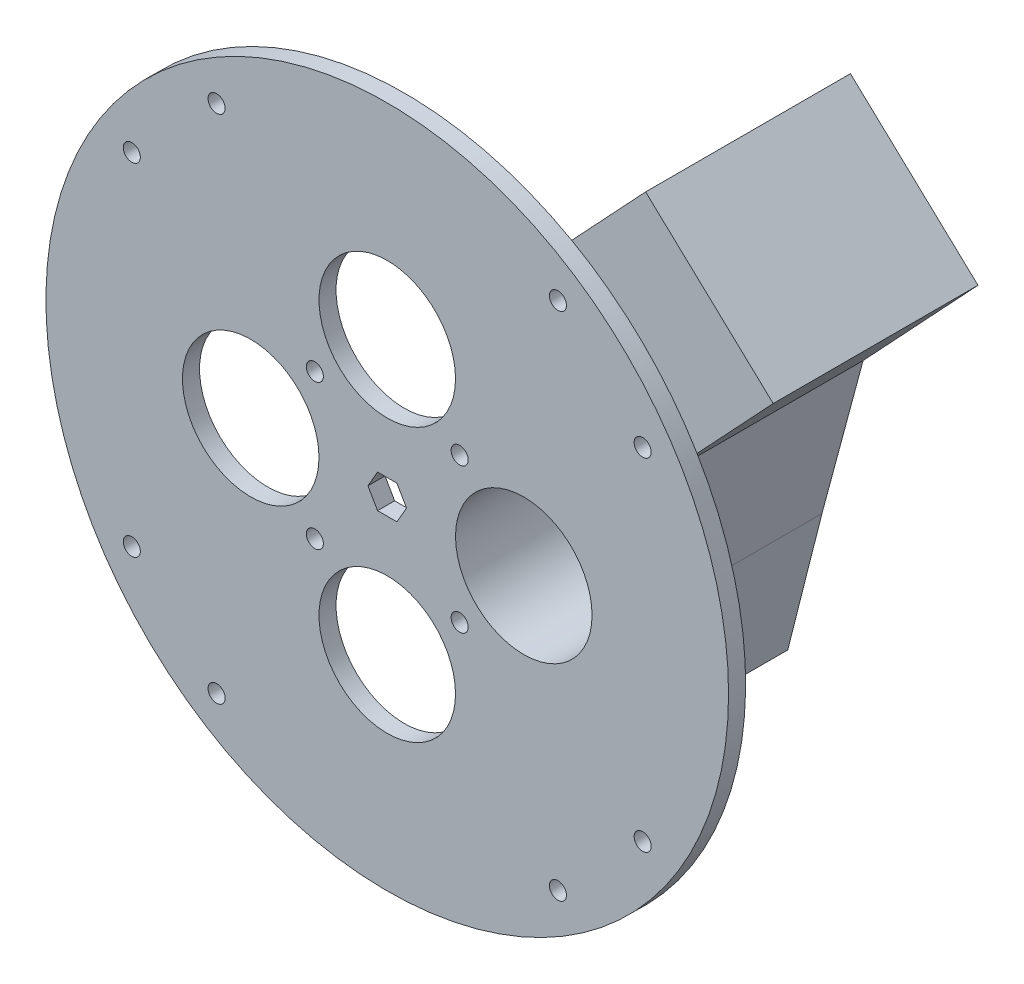
ISO-10303-21;
HEADER;
FILE_DESCRIPTION(('STEP AP214'),'2;1');
FILE_NAME('part.step','',(''),(''),'','','');
FILE_SCHEMA(('AUTOMOTIVE_DESIGN { 1 0 10303 214 1 1 1 1 }'));
ENDSEC;
DATA;
#1=APPLICATION_CONTEXT('core data for automotive mechanical design processes');
#2=APPLICATION_PROTOCOL_DEFINITION('international standard','automotive_design',2000,#1);
#3=PRODUCT_CONTEXT('',#1,'mechanical');
#4=PRODUCT('Part','Part','',(#3));
#5=PRODUCT_RELATED_PRODUCT_CATEGORY('part','',(#4));
#6=PRODUCT_DEFINITION_FORMATION('','',#4);
#7=PRODUCT_DEFINITION_CONTEXT('part definition',#1,'design');
#8=PRODUCT_DEFINITION('design','',#6,#7);
#9=PRODUCT_DEFINITION_SHAPE('','',#8);
#10=(LENGTH_UNIT() NAMED_UNIT(*) SI_UNIT(.MILLI.,.METRE.));
#11=(NAMED_UNIT(*) PLANE_ANGLE_UNIT() SI_UNIT($,.RADIAN.));
#12=(NAMED_UNIT(*) SI_UNIT($,.STERADIAN.) SOLID_ANGLE_UNIT());
#13=UNCERTAINTY_MEASURE_WITH_UNIT(LENGTH_MEASURE(1.E-05),#10,'distance_accuracy_value','');
#14=(GEOMETRIC_REPRESENTATION_CONTEXT(3) GLOBAL_UNCERTAINTY_ASSIGNED_CONTEXT((#13)) GLOBAL_UNIT_ASSIGNED_CONTEXT((#10,
#11,#12)) REPRESENTATION_CONTEXT('',''));
#15=CARTESIAN_POINT('',(0.,0.,0.));
#16=DIRECTION('',(0.,0.,1.));
#17=DIRECTION('',(1.,0.,0.));
#18=AXIS2_PLACEMENT_3D('',#15,#16,#17);
#19=CARTESIAN_POINT('',(0.,0.,0.));
#20=DIRECTION('',(0.,0.,1.));
#21=DIRECTION('',(1.,0.,0.));
#22=AXIS2_PLACEMENT_3D('',#19,#20,#21);
#23=PLANE('',#22);
#24=CARTESIAN_POINT('',(-50.8,0.,0.));
#25=DIRECTION('',(0.,0.,1.));
#26=DIRECTION('',(1.,0.,0.));
#27=AXIS2_PLACEMENT_3D('',#24,#25,#26);
#28=CIRCLE('',#27,25.4);
#29=CARTESIAN_POINT('',(-25.4,0.,0.));
#30=VERTEX_POINT('',#29);
#31=EDGE_CURVE('E274',#30,#30,#28,.T.);
#32=ORIENTED_EDGE('',*,*,#31,.T.);
#33=EDGE_LOOP('',(#32));
#34=FACE_BOUND('',#33,.T.);
#35=CARTESIAN_POINT('',(0.,-50.8,0.));
#36=DIRECTION('',(0.,0.,1.));
#37=DIRECTION('',(1.,0.,0.));
#38=AXIS2_PLACEMENT_3D('',#35,#36,#37);
#39=CIRCLE('',#38,25.4);
#40=CARTESIAN_POINT('',(25.4,-50.8,0.));
#41=VERTEX_POINT('',#40);
#42=EDGE_CURVE('E278',#41,#41,#39,.T.);
#43=ORIENTED_EDGE('',*,*,#42,.T.);
#44=EDGE_LOOP('',(#43));
#45=FACE_BOUND('',#44,.T.);
#46=DIRECTION('',(0.5,0.866025403784439,0.));
#47=VECTOR('',#46,1.);
#48=CARTESIAN_POINT('',(3.59285072516704,-6.223,0.));
#49=LINE('',#48,#47);
#50=CARTESIAN_POINT('',(3.59285072516704,-6.223,0.));
#51=VERTEX_POINT('',#50);
#52=CARTESIAN_POINT('',(7.18570145033408,0.,0.));
#53=VERTEX_POINT('',#52);
#54=EDGE_CURVE('E289',#51,#53,#49,.T.);
#55=ORIENTED_EDGE('',*,*,#54,.T.);
#56=DIRECTION('',(-0.5,0.866025403784438,0.));
#57=VECTOR('',#56,1.);
#58=CARTESIAN_POINT('',(7.18570145033408,0.,0.));
#59=LINE('',#58,#57);
#60=CARTESIAN_POINT('',(3.59285072516704,6.223,0.));
#61=VERTEX_POINT('',#60);
#62=EDGE_CURVE('E307',#53,#61,#59,.T.);
#63=ORIENTED_EDGE('',*,*,#62,.T.);
#64=DIRECTION('',(-1.,0.,0.));
#65=VECTOR('',#64,1.);
#66=CARTESIAN_POINT('',(3.59285072516704,6.223,0.));
#67=LINE('',#66,#65);
#68=CARTESIAN_POINT('',(-3.59285072516704,6.223,0.));
#69=VERTEX_POINT('',#68);
#70=EDGE_CURVE('E310',#61,#69,#67,.T.);
#71=ORIENTED_EDGE('',*,*,#70,.T.);
#72=DIRECTION('',(-0.5,-0.866025403784439,0.));
#73=VECTOR('',#72,1.);
#74=CARTESIAN_POINT('',(-3.59285072516704,6.223,0.));
#75=LINE('',#74,#73);
#76=CARTESIAN_POINT('',(-7.18570145033408,0.,0.));
#77=VERTEX_POINT('',#76);
#78=EDGE_CURVE('E313',#69,#77,#75,.T.);
#79=ORIENTED_EDGE('',*,*,#78,.T.);
#80=DIRECTION('',(0.5,-0.866025403784439,0.));
#81=VECTOR('',#80,1.);
#82=CARTESIAN_POINT('',(-7.18570145033408,0.,0.));
#83=LINE('',#82,#81);
#84=CARTESIAN_POINT('',(-3.59285072516704,-6.223,0.));
#85=VERTEX_POINT('',#84);
#86=EDGE_CURVE('E316',#77,#85,#83,.T.);
#87=ORIENTED_EDGE('',*,*,#86,.T.);
#88=DIRECTION('',(1.,0.,0.));
#89=VECTOR('',#88,1.);
#90=CARTESIAN_POINT('',(-3.59285072516704,-6.223,0.));
#91=LINE('',#90,#89);
#92=EDGE_CURVE('E293',#85,#51,#91,.T.);
#93=ORIENTED_EDGE('',*,*,#92,.T.);
#94=EDGE_LOOP('',(#55,#63,#71,#79,#87,#93));
#95=FACE_BOUND('',#94,.T.);
#96=CARTESIAN_POINT('',(0.,50.8,0.));
#97=DIRECTION('',(0.,0.,1.));
#98=DIRECTION('',(1.,0.,0.));
#99=AXIS2_PLACEMENT_3D('',#96,#97,#98);
#100=CIRCLE('',#99,25.4);
#101=CARTESIAN_POINT('',(25.4,50.8,0.));
#102=VERTEX_POINT('',#101);
#103=EDGE_CURVE('E334',#102,#102,#100,.T.);
#104=ORIENTED_EDGE('',*,*,#103,.T.);
#105=EDGE_LOOP('',(#104));
#106=FACE_BOUND('',#105,.T.);
#107=CARTESIAN_POINT('',(-63.5,-95.0380976240581,0.));
#108=DIRECTION('',(0.,0.,-1.));
#109=DIRECTION('',(-1.,0.,0.));
#110=AXIS2_PLACEMENT_3D('',#107,#108,#109);
#111=CIRCLE('',#110,3.175);
#112=CARTESIAN_POINT('',(-66.675,-95.0380976240581,0.));
#113=VERTEX_POINT('',#112);
#114=EDGE_CURVE('E222',#113,#113,#111,.T.);
#115=ORIENTED_EDGE('',*,*,#114,.F.);
#116=EDGE_LOOP('',(#115));
#117=FACE_BOUND('',#116,.T.);
#118=CARTESIAN_POINT('',(95.0380976240581,-63.5,0.));
#119=DIRECTION('',(0.,0.,-1.));
#120=DIRECTION('',(-1.,0.,0.));
#121=AXIS2_PLACEMENT_3D('',#118,#119,#120);
#122=CIRCLE('',#121,3.175);
#123=CARTESIAN_POINT('',(91.8630976240581,-63.5,0.));
#124=VERTEX_POINT('',#123);
#125=EDGE_CURVE('E206',#124,#124,#122,.T.);
#126=ORIENTED_EDGE('',*,*,#125,.F.);
#127=EDGE_LOOP('',(#126));
#128=FACE_BOUND('',#127,.T.);
#129=CARTESIAN_POINT('',(-63.5,95.0380976240581,0.));
#130=DIRECTION('',(0.,0.,-1.));
#131=DIRECTION('',(-1.,0.,0.));
#132=AXIS2_PLACEMENT_3D('',#129,#130,#131);
#133=CIRCLE('',#132,3.175);
#134=CARTESIAN_POINT('',(-66.675,95.0380976240581,0.));
#135=VERTEX_POINT('',#134);
#136=EDGE_CURVE('E242',#135,#135,#133,.T.);
#137=ORIENTED_EDGE('',*,*,#136,.F.);
#138=EDGE_LOOP('',(#137));
#139=FACE_BOUND('',#138,.T.);
#140=CARTESIAN_POINT('',(26.9407683632075,-26.9407683632075,0.));
#141=DIRECTION('',(0.,0.,-1.));
#142=DIRECTION('',(-1.,0.,0.));
#143=AXIS2_PLACEMENT_3D('',#140,#141,#142);
#144=CIRCLE('',#143,3.175);
#145=CARTESIAN_POINT('',(23.7657683632075,-26.9407683632075,0.));
#146=VERTEX_POINT('',#145);
#147=EDGE_CURVE('E252',#146,#146,#144,.T.);
#148=ORIENTED_EDGE('',*,*,#147,.F.);
#149=EDGE_LOOP('',(#148));
#150=FACE_BOUND('',#149,.T.);
#151=CARTESIAN_POINT('',(-26.9407683632075,-26.9407683632075,0.));
#152=DIRECTION('',(0.,0.,-1.));
#153=DIRECTION('',(-1.,0.,0.));
#154=AXIS2_PLACEMENT_3D('',#151,#152,#153);
#155=CIRCLE('',#154,3.175);
#156=CARTESIAN_POINT('',(-30.1157683632075,-26.9407683632075,0.));
#157=VERTEX_POINT('',#156);
#158=EDGE_CURVE('E251',#157,#157,#155,.T.);
#159=ORIENTED_EDGE('',*,*,#158,.F.);
#160=EDGE_LOOP('',(#159));
#161=FACE_BOUND('',#160,.T.);
#162=CARTESIAN_POINT('',(-26.9407683632075,26.9407683632075,0.));
#163=DIRECTION('',(0.,0.,-1.));
#164=DIRECTION('',(-1.,0.,0.));
#165=AXIS2_PLACEMENT_3D('',#162,#163,#164);
#166=CIRCLE('',#165,3.175);
#167=CARTESIAN_POINT('',(-30.1157683632075,26.9407683632075,0.));
#168=VERTEX_POINT('',#167);
#169=EDGE_CURVE('E264',#168,#168,#166,.T.);
#170=ORIENTED_EDGE('',*,*,#169,.F.);
#171=EDGE_LOOP('',(#170));
#172=FACE_BOUND('',#171,.T.);
#173=CARTESIAN_POINT('',(63.5,-95.0380976240581,0.));
#174=DIRECTION('',(0.,0.,-1.));
#175=DIRECTION('',(-1.,0.,0.));
#176=AXIS2_PLACEMENT_3D('',#173,#174,#175);
#177=CIRCLE('',#176,3.175);
#178=CARTESIAN_POINT('',(60.325,-95.0380976240581,0.));
#179=VERTEX_POINT('',#178);
#180=EDGE_CURVE('E221',#179,#179,#177,.T.);
#181=ORIENTED_EDGE('',*,*,#180,.F.);
#182=EDGE_LOOP('',(#181));
#183=FACE_BOUND('',#182,.T.);
#184=CARTESIAN_POINT('',(-95.0380976240581,63.5,0.));
#185=DIRECTION('',(0.,0.,-1.));
#186=DIRECTION('',(-1.,0.,0.));
#187=AXIS2_PLACEMENT_3D('',#184,#185,#186);
#188=CIRCLE('',#187,3.175);
#189=CARTESIAN_POINT('',(-98.2130976240581,63.5,0.));
#190=VERTEX_POINT('',#189);
#191=EDGE_CURVE('E231',#190,#190,#188,.T.);
#192=ORIENTED_EDGE('',*,*,#191,.F.);
#193=EDGE_LOOP('',(#192));
#194=FACE_BOUND('',#193,.T.);
#195=CARTESIAN_POINT('',(-95.0380976240581,-63.5,0.));
#196=DIRECTION('',(0.,0.,-1.));
#197=DIRECTION('',(-1.,0.,0.));
#198=AXIS2_PLACEMENT_3D('',#195,#196,#197);
#199=CIRCLE('',#198,3.175);
#200=CARTESIAN_POINT('',(-98.2130976240581,-63.5,0.));
#201=VERTEX_POINT('',#200);
#202=EDGE_CURVE('E230',#201,#201,#199,.T.);
#203=ORIENTED_EDGE('',*,*,#202,.F.);
#204=EDGE_LOOP('',(#203));
#205=FACE_BOUND('',#204,.T.);
#206=DIRECTION('',(0.683604049055873,0.729853070223326,0.));
#207=VECTOR('',#206,1.);
#208=CARTESIAN_POINT('',(-22.0305546967571,20.6345318093159,0.));
#209=LINE('',#208,#207);
#210=CARTESIAN_POINT('',(47.0311545792,94.3685897329668,0.));
#211=VERTEX_POINT('',#210);
#212=CARTESIAN_POINT('',(62.2993427367684,110.669742452789,0.));
#213=VERTEX_POINT('',#212);
#214=EDGE_CURVE('E84',#211,#213,#209,.T.);
#215=ORIENTED_EDGE('',*,*,#214,.F.);
#216=DIRECTION('',(0.271367202988964,0.96247589120037,0.));
#217=VECTOR('',#216,1.);
#218=CARTESIAN_POINT('',(18.9201702892467,-5.33448550598439,0.));
#219=LINE('',#218,#217);
#220=CARTESIAN_POINT('',(29.1567831832751,30.9723821240508,0.));
#221=VERTEX_POINT('',#220);
#222=EDGE_CURVE('E88',#221,#211,#219,.T.);
#223=ORIENTED_EDGE('',*,*,#222,.F.);
#224=CARTESIAN_POINT('',(26.9407683632075,26.9407683632075,0.));
#225=DIRECTION('',(0.,0.,-1.));
#226=DIRECTION('',(-1.,0.,0.));
#227=AXIS2_PLACEMENT_3D('',#224,#225,#226);
#228=CIRCLE('',#227,4.60050336369626);
#229=CARTESIAN_POINT('',(26.7244186504801,22.3453549975587,0.));
#230=VERTEX_POINT('',#229);
#231=EDGE_CURVE('E364',#230,#221,#228,.T.);
#232=ORIENTED_EDGE('',*,*,#231,.F.);
#233=DIRECTION('',(0.271367202988964,0.96247589120037,0.));
#234=VECTOR('',#233,1.);
#235=CARTESIAN_POINT('',(18.9201702892467,-5.33448550598439,0.));
#236=LINE('',#235,#234);
#237=CARTESIAN_POINT('',(17.2573533753173,-11.2321075233414,0.));
#238=VERTEX_POINT('',#237);
#239=EDGE_CURVE('E361',#238,#230,#236,.T.);
#240=ORIENTED_EDGE('',*,*,#239,.F.);
#241=DIRECTION('',(0.729853070223325,-0.683604049055874,0.));
#242=VECTOR('',#241,1.);
#243=CARTESIAN_POINT('',(2.46057021275124,2.62703933184247,0.));
#244=LINE('',#243,#242);
#245=CARTESIAN_POINT('',(66.4838523248843,-57.3392424737663,0.));
#246=VERTEX_POINT('',#245);
#247=EDGE_CURVE('E359',#238,#246,#244,.T.);
#248=ORIENTED_EDGE('',*,*,#247,.T.);
#249=DIRECTION('',(0.244931079824277,0.969540492262244,0.));
#250=VECTOR('',#249,1.);
#251=CARTESIAN_POINT('',(76.1117882886598,-19.2278121869878,0.));
#252=LINE('',#251,#250);
#253=CARTESIAN_POINT('',(79.1851308852181,-7.06222627565547,0.));
#254=VERTEX_POINT('',#253);
#255=EDGE_CURVE('E353',#246,#254,#252,.T.);
#256=ORIENTED_EDGE('',*,*,#255,.T.);
#257=DIRECTION('',(-0.259649441349289,-0.965702939628436,0.));
#258=VECTOR('',#257,1.);
#259=CARTESIAN_POINT('',(75.6174534841674,-20.3313345623389,0.));
#260=LINE('',#259,#258);
#261=CARTESIAN_POINT('',(94.5021533752934,49.9057131435646,0.));
#262=VERTEX_POINT('',#261);
#263=EDGE_CURVE('E351',#262,#254,#260,.T.);
#264=ORIENTED_EDGE('',*,*,#263,.F.);
#265=DIRECTION('',(-0.683604049055874,-0.729853070223325,0.));
#266=VECTOR('',#265,1.);
#267=CARTESIAN_POINT('',(25.4404440993363,-23.8283447800862,0.));
#268=LINE('',#267,#266);
#269=CARTESIAN_POINT('',(108.924128069199,65.303402088748,0.));
#270=VERTEX_POINT('',#269);
#271=EDGE_CURVE('E47',#270,#262,#268,.T.);
#272=ORIENTED_EDGE('',*,*,#271,.F.);
#273=CARTESIAN_POINT('',(0.,0.,0.));
#274=DIRECTION('',(0.,0.,1.));
#275=DIRECTION('',(1.,0.,0.));
#276=AXIS2_PLACEMENT_3D('',#273,#274,#275);
#277=CIRCLE('',#276,127.);
#278=EDGE_CURVE('E338',#213,#270,#277,.T.);
#279=ORIENTED_EDGE('',*,*,#278,.F.);
#280=EDGE_LOOP('',(#215,#223,#232,#240,#248,#256,#264,#272,#279));
#281=FACE_BOUND('',#280,.T.);
#282=ADVANCED_FACE('F66',(#34,#45,#95,#106,#117,#128,#139,#150,#161,#172,#183,#194,#205,#281),
#23,.F.);
#283=CARTESIAN_POINT('',(0.,0.,6.35));
#284=DIRECTION('',(0.,0.,1.));
#285=DIRECTION('',(1.,0.,0.));
#286=AXIS2_PLACEMENT_3D('',#283,#284,#285);
#287=PLANE('',#286);
#288=CARTESIAN_POINT('',(63.5,95.0380976240581,6.35));
#289=DIRECTION('',(0.,0.,-1.));
#290=DIRECTION('',(-1.,0.,0.));
#291=AXIS2_PLACEMENT_3D('',#288,#289,#290);
#292=CIRCLE('',#291,3.175);
#293=CARTESIAN_POINT('',(60.325,95.0380976240581,6.35));
#294=VERTEX_POINT('',#293);
#295=EDGE_CURVE('E239',#294,#294,#292,.T.);
#296=ORIENTED_EDGE('',*,*,#295,.T.);
#297=EDGE_LOOP('',(#296));
#298=FACE_BOUND('',#297,.T.);
#299=CARTESIAN_POINT('',(-95.0380976240581,-63.5,6.35));
#300=DIRECTION('',(0.,0.,-1.));
#301=DIRECTION('',(-1.,0.,0.));
#302=AXIS2_PLACEMENT_3D('',#299,#300,#301);
#303=CIRCLE('',#302,3.175);
#304=CARTESIAN_POINT('',(-98.2130976240581,-63.5,6.35));
#305=VERTEX_POINT('',#304);
#306=EDGE_CURVE('E243',#305,#305,#303,.T.);
#307=ORIENTED_EDGE('',*,*,#306,.T.);
#308=EDGE_LOOP('',(#307));
#309=FACE_BOUND('',#308,.T.);
#310=CARTESIAN_POINT('',(-95.0380976240581,63.5,6.35));
#311=DIRECTION('',(0.,0.,-1.));
#312=DIRECTION('',(-1.,0.,0.));
#313=AXIS2_PLACEMENT_3D('',#310,#311,#312);
#314=CIRCLE('',#313,3.175);
#315=CARTESIAN_POINT('',(-98.2130976240581,63.5,6.35));
#316=VERTEX_POINT('',#315);
#317=EDGE_CURVE('E227',#316,#316,#314,.T.);
#318=ORIENTED_EDGE('',*,*,#317,.T.);
#319=EDGE_LOOP('',(#318));
#320=FACE_BOUND('',#319,.T.);
#321=CARTESIAN_POINT('',(63.5,-95.0380976240581,6.35));
#322=DIRECTION('',(0.,0.,-1.));
#323=DIRECTION('',(-1.,0.,0.));
#324=AXIS2_PLACEMENT_3D('',#321,#322,#323);
#325=CIRCLE('',#324,3.175);
#326=CARTESIAN_POINT('',(60.325,-95.0380976240581,6.35));
#327=VERTEX_POINT('',#326);
#328=EDGE_CURVE('E234',#327,#327,#325,.T.);
#329=ORIENTED_EDGE('',*,*,#328,.T.);
#330=EDGE_LOOP('',(#329));
#331=FACE_BOUND('',#330,.T.);
#332=CARTESIAN_POINT('',(-26.9407683632075,26.9407683632075,6.35));
#333=DIRECTION('',(0.,0.,-1.));
#334=DIRECTION('',(-1.,0.,0.));
#335=AXIS2_PLACEMENT_3D('',#332,#333,#334);
#336=CIRCLE('',#335,3.175);
#337=CARTESIAN_POINT('',(-30.1157683632075,26.9407683632075,6.35));
#338=VERTEX_POINT('',#337);
#339=EDGE_CURVE('E260',#338,#338,#336,.T.);
#340=ORIENTED_EDGE('',*,*,#339,.T.);
#341=EDGE_LOOP('',(#340));
#342=FACE_BOUND('',#341,.T.);
#343=CARTESIAN_POINT('',(-26.9407683632075,-26.9407683632075,6.35));
#344=DIRECTION('',(0.,0.,-1.));
#345=DIRECTION('',(-1.,0.,0.));
#346=AXIS2_PLACEMENT_3D('',#343,#344,#345);
#347=CIRCLE('',#346,3.175);
#348=CARTESIAN_POINT('',(-30.1157683632075,-26.9407683632075,6.35));
#349=VERTEX_POINT('',#348);
#350=EDGE_CURVE('E267',#349,#349,#347,.T.);
#351=ORIENTED_EDGE('',*,*,#350,.T.);
#352=EDGE_LOOP('',(#351));
#353=FACE_BOUND('',#352,.T.);
#354=CARTESIAN_POINT('',(26.9407683632075,-26.9407683632075,6.35));
#355=DIRECTION('',(0.,0.,-1.));
#356=DIRECTION('',(-1.,0.,0.));
#357=AXIS2_PLACEMENT_3D('',#354,#355,#356);
#358=CIRCLE('',#357,3.175);
#359=CARTESIAN_POINT('',(23.7657683632075,-26.9407683632075,6.35));
#360=VERTEX_POINT('',#359);
#361=EDGE_CURVE('E248',#360,#360,#358,.T.);
#362=ORIENTED_EDGE('',*,*,#361,.T.);
#363=EDGE_LOOP('',(#362));
#364=FACE_BOUND('',#363,.T.);
#365=CARTESIAN_POINT('',(-63.5,95.0380976240581,6.35));
#366=DIRECTION('',(0.,0.,-1.));
#367=DIRECTION('',(-1.,0.,0.));
#368=AXIS2_PLACEMENT_3D('',#365,#366,#367);
#369=CIRCLE('',#368,3.175);
#370=CARTESIAN_POINT('',(-66.675,95.0380976240581,6.35));
#371=VERTEX_POINT('',#370);
#372=EDGE_CURVE('E255',#371,#371,#369,.T.);
#373=ORIENTED_EDGE('',*,*,#372,.T.);
#374=EDGE_LOOP('',(#373));
#375=FACE_BOUND('',#374,.T.);
#376=CARTESIAN_POINT('',(95.0380976240581,-63.5,6.35));
#377=DIRECTION('',(0.,0.,-1.));
#378=DIRECTION('',(-1.,0.,0.));
#379=AXIS2_PLACEMENT_3D('',#376,#377,#378);
#380=CIRCLE('',#379,3.175);
#381=CARTESIAN_POINT('',(91.8630976240581,-63.5,6.35));
#382=VERTEX_POINT('',#381);
#383=EDGE_CURVE('E209',#382,#382,#380,.T.);
#384=ORIENTED_EDGE('',*,*,#383,.T.);
#385=EDGE_LOOP('',(#384));
#386=FACE_BOUND('',#385,.T.);
#387=CARTESIAN_POINT('',(95.0380976240581,63.5,6.35));
#388=DIRECTION('',(0.,0.,-1.));
#389=DIRECTION('',(-1.,0.,0.));
#390=AXIS2_PLACEMENT_3D('',#387,#388,#389);
#391=CIRCLE('',#390,3.17499999999997);
#392=CARTESIAN_POINT('',(91.8630976240582,63.5,6.35));
#393=VERTEX_POINT('',#392);
#394=EDGE_CURVE('E216',#393,#393,#391,.T.);
#395=ORIENTED_EDGE('',*,*,#394,.T.);
#396=EDGE_LOOP('',(#395));
#397=FACE_BOUND('',#396,.T.);
#398=CARTESIAN_POINT('',(-63.5,-95.0380976240581,6.35));
#399=DIRECTION('',(0.,0.,-1.));
#400=DIRECTION('',(-1.,0.,0.));
#401=AXIS2_PLACEMENT_3D('',#398,#399,#400);
#402=CIRCLE('',#401,3.175);
#403=CARTESIAN_POINT('',(-66.675,-95.0380976240581,6.35));
#404=VERTEX_POINT('',#403);
#405=EDGE_CURVE('E218',#404,#404,#402,.T.);
#406=ORIENTED_EDGE('',*,*,#405,.T.);
#407=EDGE_LOOP('',(#406));
#408=FACE_BOUND('',#407,.T.);
#409=CARTESIAN_POINT('',(26.9407683632075,26.9407683632075,6.35));
#410=DIRECTION('',(0.,0.,-1.));
#411=DIRECTION('',(-1.,0.,0.));
#412=AXIS2_PLACEMENT_3D('',#409,#410,#411);
#413=CIRCLE('',#412,3.175);
#414=CARTESIAN_POINT('',(23.7657683632075,26.9407683632075,6.35));
#415=VERTEX_POINT('',#414);
#416=EDGE_CURVE('E263',#415,#415,#413,.T.);
#417=ORIENTED_EDGE('',*,*,#416,.T.);
#418=EDGE_LOOP('',(#417));
#419=FACE_BOUND('',#418,.T.);
#420=CARTESIAN_POINT('',(0.,-50.8,6.35));
#421=DIRECTION('',(0.,0.,1.));
#422=DIRECTION('',(1.,0.,0.));
#423=AXIS2_PLACEMENT_3D('',#420,#421,#422);
#424=CIRCLE('',#423,25.4);
#425=CARTESIAN_POINT('',(25.4,-50.8,6.35));
#426=VERTEX_POINT('',#425);
#427=EDGE_CURVE('E281',#426,#426,#424,.T.);
#428=ORIENTED_EDGE('',*,*,#427,.F.);
#429=EDGE_LOOP('',(#428));
#430=FACE_BOUND('',#429,.T.);
#431=DIRECTION('',(-0.5,0.866025403784438,0.));
#432=VECTOR('',#431,1.);
#433=CARTESIAN_POINT('',(7.18570145033408,0.,6.35));
#434=LINE('',#433,#432);
#435=CARTESIAN_POINT('',(7.18570145033408,0.,6.35));
#436=VERTEX_POINT('',#435);
#437=CARTESIAN_POINT('',(3.59285072516704,6.223,6.35));
#438=VERTEX_POINT('',#437);
#439=EDGE_CURVE('E292',#436,#438,#434,.T.);
#440=ORIENTED_EDGE('',*,*,#439,.F.);
#441=DIRECTION('',(0.5,0.866025403784439,0.));
#442=VECTOR('',#441,1.);
#443=CARTESIAN_POINT('',(3.59285072516704,-6.223,6.35));
#444=LINE('',#443,#442);
#445=CARTESIAN_POINT('',(3.59285072516704,-6.223,6.35));
#446=VERTEX_POINT('',#445);
#447=EDGE_CURVE('E290',#446,#436,#444,.T.);
#448=ORIENTED_EDGE('',*,*,#447,.F.);
#449=DIRECTION('',(1.,0.,0.));
#450=VECTOR('',#449,1.);
#451=CARTESIAN_POINT('',(-3.59285072516704,-6.223,6.35));
#452=LINE('',#451,#450);
#453=CARTESIAN_POINT('',(-3.59285072516704,-6.223,6.35));
#454=VERTEX_POINT('',#453);
#455=EDGE_CURVE('E302',#454,#446,#452,.T.);
#456=ORIENTED_EDGE('',*,*,#455,.F.);
#457=DIRECTION('',(0.5,-0.866025403784439,0.));
#458=VECTOR('',#457,1.);
#459=CARTESIAN_POINT('',(-7.18570145033408,0.,6.35));
#460=LINE('',#459,#458);
#461=CARTESIAN_POINT('',(-7.18570145033408,0.,6.35));
#462=VERTEX_POINT('',#461);
#463=EDGE_CURVE('E299',#462,#454,#460,.T.);
#464=ORIENTED_EDGE('',*,*,#463,.F.);
#465=DIRECTION('',(-0.5,-0.866025403784439,0.));
#466=VECTOR('',#465,1.);
#467=CARTESIAN_POINT('',(-3.59285072516704,6.223,6.35));
#468=LINE('',#467,#466);
#469=CARTESIAN_POINT('',(-3.59285072516704,6.223,6.35));
#470=VERTEX_POINT('',#469);
#471=EDGE_CURVE('E297',#470,#462,#468,.T.);
#472=ORIENTED_EDGE('',*,*,#471,.F.);
#473=DIRECTION('',(-1.,0.,0.));
#474=VECTOR('',#473,1.);
#475=CARTESIAN_POINT('',(3.59285072516704,6.223,6.35));
#476=LINE('',#475,#474);
#477=EDGE_CURVE('E295',#438,#470,#476,.T.);
#478=ORIENTED_EDGE('',*,*,#477,.F.);
#479=EDGE_LOOP('',(#440,#448,#456,#464,#472,#478));
#480=FACE_BOUND('',#479,.T.);
#481=CARTESIAN_POINT('',(0.,50.8,6.35));
#482=DIRECTION('',(0.,0.,1.));
#483=DIRECTION('',(1.,0.,0.));
#484=AXIS2_PLACEMENT_3D('',#481,#482,#483);
#485=CIRCLE('',#484,25.4);
#486=CARTESIAN_POINT('',(25.4,50.8,6.35));
#487=VERTEX_POINT('',#486);
#488=EDGE_CURVE('E335',#487,#487,#485,.T.);
#489=ORIENTED_EDGE('',*,*,#488,.F.);
#490=EDGE_LOOP('',(#489));
#491=FACE_BOUND('',#490,.T.);
#492=CARTESIAN_POINT('',(0.,0.,6.35));
#493=DIRECTION('',(0.,0.,1.));
#494=DIRECTION('',(1.,0.,0.));
#495=AXIS2_PLACEMENT_3D('',#492,#493,#494);
#496=CIRCLE('',#495,127.);
#497=CARTESIAN_POINT('',(127.,0.,6.35));
#498=VERTEX_POINT('',#497);
#499=EDGE_CURVE('E75',#498,#498,#496,.T.);
#500=ORIENTED_EDGE('',*,*,#499,.T.);
#501=EDGE_LOOP('',(#500));
#502=FACE_BOUND('',#501,.T.);
#503=CARTESIAN_POINT('',(50.8,0.,6.35));
#504=DIRECTION('',(0.,0.,1.));
#505=DIRECTION('',(1.,0.,0.));
#506=AXIS2_PLACEMENT_3D('',#503,#504,#505);
#507=CIRCLE('',#506,25.4);
#508=CARTESIAN_POINT('',(76.2,0.,6.35));
#509=VERTEX_POINT('',#508);
#510=EDGE_CURVE('E284',#509,#509,#507,.T.);
#511=ORIENTED_EDGE('',*,*,#510,.F.);
#512=EDGE_LOOP('',(#511));
#513=FACE_BOUND('',#512,.T.);
#514=CARTESIAN_POINT('',(-50.8,0.,6.35));
#515=DIRECTION('',(0.,0.,1.));
#516=DIRECTION('',(1.,0.,0.));
#517=AXIS2_PLACEMENT_3D('',#514,#515,#516);
#518=CIRCLE('',#517,25.4);
#519=CARTESIAN_POINT('',(-25.4,0.,6.35));
#520=VERTEX_POINT('',#519);
#521=EDGE_CURVE('E275',#520,#520,#518,.T.);
#522=ORIENTED_EDGE('',*,*,#521,.F.);
#523=EDGE_LOOP('',(#522));
#524=FACE_BOUND('',#523,.T.);
#525=ADVANCED_FACE('F443',(#298,#309,#320,#331,#342,#353,#364,#375,#386,#397,#408,#419,#430,
#480,#491,#502,#513,#524),#287,.T.);
#526=CARTESIAN_POINT('',(0.,0.,6.35));
#527=DIRECTION('',(0.,0.,-1.));
#528=DIRECTION('',(-1.,0.,0.));
#529=AXIS2_PLACEMENT_3D('',#526,#527,#528);
#530=CYLINDRICAL_SURFACE('',#529,127.);
#531=ORIENTED_EDGE('',*,*,#499,.F.);
#532=EDGE_LOOP('',(#531));
#533=FACE_BOUND('',#532,.T.);
#534=EDGE_CURVE('E70',#270,#213,#277,.T.);
#535=ORIENTED_EDGE('',*,*,#534,.T.);
#536=ORIENTED_EDGE('',*,*,#278,.T.);
#537=EDGE_LOOP('',(#535,#536));
#538=FACE_BOUND('',#537,.T.);
#539=ADVANCED_FACE('F68',(#533,#538),#530,.T.);
#540=CARTESIAN_POINT('',(0.,50.8,6.35));
#541=DIRECTION('',(0.,0.,-1.));
#542=DIRECTION('',(-1.,0.,0.));
#543=AXIS2_PLACEMENT_3D('',#540,#541,#542);
#544=CYLINDRICAL_SURFACE('',#543,25.4);
#545=ORIENTED_EDGE('',*,*,#488,.T.);
#546=EDGE_LOOP('',(#545));
#547=FACE_BOUND('',#546,.T.);
#548=ORIENTED_EDGE('',*,*,#103,.F.);
#549=EDGE_LOOP('',(#548));
#550=FACE_BOUND('',#549,.T.);
#551=ADVANCED_FACE('F452',(#547,#550),#544,.F.);
#552=CARTESIAN_POINT('',(3.59285072516704,-6.223,6.35));
#553=DIRECTION('',(-0.866025403784439,0.5,0.));
#554=DIRECTION('',(-0.5,-0.866025403784439,0.));
#555=AXIS2_PLACEMENT_3D('',#552,#553,#554);
#556=PLANE('',#555);
#557=ORIENTED_EDGE('',*,*,#54,.F.);
#558=DIRECTION('',(0.,0.,-1.));
#559=VECTOR('',#558,1.);
#560=CARTESIAN_POINT('',(3.59285072516704,-6.223,6.35));
#561=LINE('',#560,#559);
#562=EDGE_CURVE('E304',#446,#51,#561,.T.);
#563=ORIENTED_EDGE('',*,*,#562,.F.);
#564=ORIENTED_EDGE('',*,*,#447,.T.);
#565=DIRECTION('',(0.,0.,-1.));
#566=VECTOR('',#565,1.);
#567=CARTESIAN_POINT('',(7.18570145033408,0.,6.35));
#568=LINE('',#567,#566);
#569=EDGE_CURVE('E331',#436,#53,#568,.T.);
#570=ORIENTED_EDGE('',*,*,#569,.T.);
#571=EDGE_LOOP('',(#557,#563,#564,#570));
#572=FACE_BOUND('',#571,.T.);
#573=ADVANCED_FACE('F455',(#572),#556,.T.);
#574=CARTESIAN_POINT('',(7.18570145033408,0.,6.35));
#575=DIRECTION('',(-0.866025403784439,-0.5,0.));
#576=DIRECTION('',(0.5,-0.866025403784439,0.));
#577=AXIS2_PLACEMENT_3D('',#574,#575,#576);
#578=PLANE('',#577);
#579=ORIENTED_EDGE('',*,*,#62,.F.);
#580=ORIENTED_EDGE('',*,*,#569,.F.);
#581=ORIENTED_EDGE('',*,*,#439,.T.);
#582=DIRECTION('',(0.,0.,-1.));
#583=VECTOR('',#582,1.);
#584=CARTESIAN_POINT('',(3.59285072516704,6.223,6.35));
#585=LINE('',#584,#583);
#586=EDGE_CURVE('E329',#438,#61,#585,.T.);
#587=ORIENTED_EDGE('',*,*,#586,.T.);
#588=EDGE_LOOP('',(#579,#580,#581,#587));
#589=FACE_BOUND('',#588,.T.);
#590=ADVANCED_FACE('F459',(#589),#578,.T.);
#591=CARTESIAN_POINT('',(3.59285072516704,6.223,6.35));
#592=DIRECTION('',(0.,-1.,0.));
#593=DIRECTION('',(0.,0.,-1.));
#594=AXIS2_PLACEMENT_3D('',#591,#592,#593);
#595=PLANE('',#594);
#596=ORIENTED_EDGE('',*,*,#70,.F.);
#597=ORIENTED_EDGE('',*,*,#586,.F.);
#598=ORIENTED_EDGE('',*,*,#477,.T.);
#599=DIRECTION('',(0.,0.,-1.));
#600=VECTOR('',#599,1.);
#601=CARTESIAN_POINT('',(-3.59285072516704,6.223,6.35));
#602=LINE('',#601,#600);
#603=EDGE_CURVE('E327',#470,#69,#602,.T.);
#604=ORIENTED_EDGE('',*,*,#603,.T.);
#605=EDGE_LOOP('',(#596,#597,#598,#604));
#606=FACE_BOUND('',#605,.T.);
#607=ADVANCED_FACE('F463',(#606),#595,.T.);
#608=CARTESIAN_POINT('',(-3.59285072516704,6.223,6.35));
#609=DIRECTION('',(0.866025403784439,-0.5,0.));
#610=DIRECTION('',(0.5,0.866025403784439,0.));
#611=AXIS2_PLACEMENT_3D('',#608,#609,#610);
#612=PLANE('',#611);
#613=ORIENTED_EDGE('',*,*,#78,.F.);
#614=ORIENTED_EDGE('',*,*,#603,.F.);
#615=ORIENTED_EDGE('',*,*,#471,.T.);
#616=DIRECTION('',(0.,0.,-1.));
#617=VECTOR('',#616,1.);
#618=CARTESIAN_POINT('',(-7.18570145033408,0.,6.35));
#619=LINE('',#618,#617);
#620=EDGE_CURVE('E325',#462,#77,#619,.T.);
#621=ORIENTED_EDGE('',*,*,#620,.T.);
#622=EDGE_LOOP('',(#613,#614,#615,#621));
#623=FACE_BOUND('',#622,.T.);
#624=ADVANCED_FACE('F467',(#623),#612,.T.);
#625=CARTESIAN_POINT('',(-7.18570145033408,0.,6.35));
#626=DIRECTION('',(0.866025403784438,0.5,0.));
#627=DIRECTION('',(-0.5,0.866025403784439,0.));
#628=AXIS2_PLACEMENT_3D('',#625,#626,#627);
#629=PLANE('',#628);
#630=ORIENTED_EDGE('',*,*,#86,.F.);
#631=ORIENTED_EDGE('',*,*,#620,.F.);
#632=ORIENTED_EDGE('',*,*,#463,.T.);
#633=DIRECTION('',(0.,0.,-1.));
#634=VECTOR('',#633,1.);
#635=CARTESIAN_POINT('',(-3.59285072516704,-6.223,6.35));
#636=LINE('',#635,#634);
#637=EDGE_CURVE('E323',#454,#85,#636,.T.);
#638=ORIENTED_EDGE('',*,*,#637,.T.);
#639=EDGE_LOOP('',(#630,#631,#632,#638));
#640=FACE_BOUND('',#639,.T.);
#641=ADVANCED_FACE('F471',(#640),#629,.T.);
#642=CARTESIAN_POINT('',(-3.59285072516704,-6.223,6.35));
#643=DIRECTION('',(0.,1.,0.));
#644=DIRECTION('',(-1.,0.,0.));
#645=AXIS2_PLACEMENT_3D('',#642,#643,#644);
#646=PLANE('',#645);
#647=ORIENTED_EDGE('',*,*,#92,.F.);
#648=ORIENTED_EDGE('',*,*,#637,.F.);
#649=ORIENTED_EDGE('',*,*,#455,.T.);
#650=ORIENTED_EDGE('',*,*,#562,.T.);
#651=EDGE_LOOP('',(#647,#648,#649,#650));
#652=FACE_BOUND('',#651,.T.);
#653=ADVANCED_FACE('F475',(#652),#646,.T.);
#654=CARTESIAN_POINT('',(50.8,0.,6.35));
#655=DIRECTION('',(0.,0.,-1.));
#656=DIRECTION('',(-1.,0.,0.));
#657=AXIS2_PLACEMENT_3D('',#654,#655,#656);
#658=CYLINDRICAL_SURFACE('',#657,25.4);
#659=ORIENTED_EDGE('',*,*,#510,.T.);
#660=EDGE_LOOP('',(#659));
#661=FACE_BOUND('',#660,.T.);
#662=CARTESIAN_POINT('',(50.8,0.,-76.2));
#663=DIRECTION('',(0.,0.,-1.));
#664=DIRECTION('',(-1.,0.,0.));
#665=AXIS2_PLACEMENT_3D('',#662,#663,#664);
#666=CIRCLE('',#665,25.4);
#667=CARTESIAN_POINT('',(25.4,0.,-76.2));
#668=VERTEX_POINT('',#667);
#669=EDGE_CURVE('E415',#668,#668,#666,.F.);
#670=ORIENTED_EDGE('',*,*,#669,.F.);
#671=EDGE_LOOP('',(#670));
#672=FACE_BOUND('',#671,.T.);
#673=ADVANCED_FACE('F479',(#661,#672),#658,.F.);
#674=CARTESIAN_POINT('',(0.,-50.8,6.35));
#675=DIRECTION('',(0.,0.,-1.));
#676=DIRECTION('',(-1.,0.,0.));
#677=AXIS2_PLACEMENT_3D('',#674,#675,#676);
#678=CYLINDRICAL_SURFACE('',#677,25.4);
#679=ORIENTED_EDGE('',*,*,#427,.T.);
#680=EDGE_LOOP('',(#679));
#681=FACE_BOUND('',#680,.T.);
#682=ORIENTED_EDGE('',*,*,#42,.F.);
#683=EDGE_LOOP('',(#682));
#684=FACE_BOUND('',#683,.T.);
#685=ADVANCED_FACE('F483',(#681,#684),#678,.F.);
#686=CARTESIAN_POINT('',(-50.8,0.,6.35));
#687=DIRECTION('',(0.,0.,-1.));
#688=DIRECTION('',(-1.,0.,0.));
#689=AXIS2_PLACEMENT_3D('',#686,#687,#688);
#690=CYLINDRICAL_SURFACE('',#689,25.4);
#691=ORIENTED_EDGE('',*,*,#521,.T.);
#692=EDGE_LOOP('',(#691));
#693=FACE_BOUND('',#692,.T.);
#694=ORIENTED_EDGE('',*,*,#31,.F.);
#695=EDGE_LOOP('',(#694));
#696=FACE_BOUND('',#695,.T.);
#697=ADVANCED_FACE('F487',(#693,#696),#690,.F.);
#698=CARTESIAN_POINT('',(26.9407683632075,26.9407683632075,6.35));
#699=DIRECTION('',(0.,0.,-1.));
#700=DIRECTION('',(-1.,0.,0.));
#701=AXIS2_PLACEMENT_3D('',#698,#699,#700);
#702=CYLINDRICAL_SURFACE('',#701,3.175);
#703=ORIENTED_EDGE('',*,*,#416,.F.);
#704=EDGE_LOOP('',(#703));
#705=FACE_BOUND('',#704,.T.);
#706=CARTESIAN_POINT('',(26.9407683632075,26.9407683632075,-76.2));
#707=DIRECTION('',(0.,0.,-1.));
#708=DIRECTION('',(-1.,0.,0.));
#709=AXIS2_PLACEMENT_3D('',#706,#707,#708);
#710=CIRCLE('',#709,3.175);
#711=CARTESIAN_POINT('',(23.7657683632075,26.9407683632075,-76.2));
#712=VERTEX_POINT('',#711);
#713=EDGE_CURVE('E418',#712,#712,#710,.F.);
#714=ORIENTED_EDGE('',*,*,#713,.F.);
#715=EDGE_LOOP('',(#714));
#716=FACE_BOUND('',#715,.T.);
#717=ADVANCED_FACE('F437',(#705,#716),#702,.F.);
#718=CARTESIAN_POINT('',(-63.5,-95.0380976240581,6.35));
#719=DIRECTION('',(0.,0.,-1.));
#720=DIRECTION('',(-1.,0.,0.));
#721=AXIS2_PLACEMENT_3D('',#718,#719,#720);
#722=CYLINDRICAL_SURFACE('',#721,3.175);
#723=ORIENTED_EDGE('',*,*,#405,.F.);
#724=EDGE_LOOP('',(#723));
#725=FACE_BOUND('',#724,.T.);
#726=ORIENTED_EDGE('',*,*,#114,.T.);
#727=EDGE_LOOP('',(#726));
#728=FACE_BOUND('',#727,.T.);
#729=ADVANCED_FACE('F427',(#725,#728),#722,.F.);
#730=CARTESIAN_POINT('',(95.0380976240581,63.5,6.35));
#731=DIRECTION('',(0.,0.,-1.));
#732=DIRECTION('',(-1.,0.,0.));
#733=AXIS2_PLACEMENT_3D('',#730,#731,#732);
#734=CYLINDRICAL_SURFACE('',#733,3.17499999999997);
#735=ORIENTED_EDGE('',*,*,#394,.F.);
#736=EDGE_LOOP('',(#735));
#737=FACE_BOUND('',#736,.T.);
#738=CARTESIAN_POINT('',(95.0380976240581,63.5,-76.2));
#739=DIRECTION('',(0.,0.,-1.));
#740=DIRECTION('',(-1.,0.,0.));
#741=AXIS2_PLACEMENT_3D('',#738,#739,#740);
#742=CIRCLE('',#741,3.17499999999997);
#743=CARTESIAN_POINT('',(91.8630976240582,63.5,-76.2));
#744=VERTEX_POINT('',#743);
#745=EDGE_CURVE('E371',#744,#744,#742,.F.);
#746=ORIENTED_EDGE('',*,*,#745,.F.);
#747=EDGE_LOOP('',(#746));
#748=FACE_BOUND('',#747,.T.);
#749=ADVANCED_FACE('F424',(#737,#748),#734,.F.);
#750=CARTESIAN_POINT('',(95.0380976240581,-63.5,6.35));
#751=DIRECTION('',(0.,0.,-1.));
#752=DIRECTION('',(-1.,0.,0.));
#753=AXIS2_PLACEMENT_3D('',#750,#751,#752);
#754=CYLINDRICAL_SURFACE('',#753,3.175);
#755=ORIENTED_EDGE('',*,*,#383,.F.);
#756=EDGE_LOOP('',(#755));
#757=FACE_BOUND('',#756,.T.);
#758=ORIENTED_EDGE('',*,*,#125,.T.);
#759=EDGE_LOOP('',(#758));
#760=FACE_BOUND('',#759,.T.);
#761=ADVANCED_FACE('F426',(#757,#760),#754,.F.);
#762=CARTESIAN_POINT('',(-63.5,95.0380976240581,6.35));
#763=DIRECTION('',(0.,0.,-1.));
#764=DIRECTION('',(-1.,0.,0.));
#765=AXIS2_PLACEMENT_3D('',#762,#763,#764);
#766=CYLINDRICAL_SURFACE('',#765,3.175);
#767=ORIENTED_EDGE('',*,*,#372,.F.);
#768=EDGE_LOOP('',(#767));
#769=FACE_BOUND('',#768,.T.);
#770=ORIENTED_EDGE('',*,*,#136,.T.);
#771=EDGE_LOOP('',(#770));
#772=FACE_BOUND('',#771,.T.);
#773=ADVANCED_FACE('F434',(#769,#772),#766,.F.);
#774=CARTESIAN_POINT('',(26.9407683632075,-26.9407683632075,6.35));
#775=DIRECTION('',(0.,0.,-1.));
#776=DIRECTION('',(-1.,0.,0.));
#777=AXIS2_PLACEMENT_3D('',#774,#775,#776);
#778=CYLINDRICAL_SURFACE('',#777,3.175);
#779=ORIENTED_EDGE('',*,*,#361,.F.);
#780=EDGE_LOOP('',(#779));
#781=FACE_BOUND('',#780,.T.);
#782=ORIENTED_EDGE('',*,*,#147,.T.);
#783=EDGE_LOOP('',(#782));
#784=FACE_BOUND('',#783,.T.);
#785=ADVANCED_FACE('F499',(#781,#784),#778,.F.);
#786=CARTESIAN_POINT('',(-26.9407683632075,-26.9407683632075,6.35));
#787=DIRECTION('',(0.,0.,-1.));
#788=DIRECTION('',(-1.,0.,0.));
#789=AXIS2_PLACEMENT_3D('',#786,#787,#788);
#790=CYLINDRICAL_SURFACE('',#789,3.175);
#791=ORIENTED_EDGE('',*,*,#350,.F.);
#792=EDGE_LOOP('',(#791));
#793=FACE_BOUND('',#792,.T.);
#794=ORIENTED_EDGE('',*,*,#158,.T.);
#795=EDGE_LOOP('',(#794));
#796=FACE_BOUND('',#795,.T.);
#797=ADVANCED_FACE('F495',(#793,#796),#790,.F.);
#798=CARTESIAN_POINT('',(-26.9407683632075,26.9407683632075,6.35));
#799=DIRECTION('',(0.,0.,-1.));
#800=DIRECTION('',(-1.,0.,0.));
#801=AXIS2_PLACEMENT_3D('',#798,#799,#800);
#802=CYLINDRICAL_SURFACE('',#801,3.175);
#803=ORIENTED_EDGE('',*,*,#339,.F.);
#804=EDGE_LOOP('',(#803));
#805=FACE_BOUND('',#804,.T.);
#806=ORIENTED_EDGE('',*,*,#169,.T.);
#807=EDGE_LOOP('',(#806));
#808=FACE_BOUND('',#807,.T.);
#809=ADVANCED_FACE('F498',(#805,#808),#802,.F.);
#810=CARTESIAN_POINT('',(63.5,-95.0380976240581,6.35));
#811=DIRECTION('',(0.,0.,-1.));
#812=DIRECTION('',(-1.,0.,0.));
#813=AXIS2_PLACEMENT_3D('',#810,#811,#812);
#814=CYLINDRICAL_SURFACE('',#813,3.175);
#815=ORIENTED_EDGE('',*,*,#328,.F.);
#816=EDGE_LOOP('',(#815));
#817=FACE_BOUND('',#816,.T.);
#818=ORIENTED_EDGE('',*,*,#180,.T.);
#819=EDGE_LOOP('',(#818));
#820=FACE_BOUND('',#819,.T.);
#821=ADVANCED_FACE('F503',(#817,#820),#814,.F.);
#822=CARTESIAN_POINT('',(-95.0380976240581,63.5,6.35));
#823=DIRECTION('',(0.,0.,-1.));
#824=DIRECTION('',(-1.,0.,0.));
#825=AXIS2_PLACEMENT_3D('',#822,#823,#824);
#826=CYLINDRICAL_SURFACE('',#825,3.175);
#827=ORIENTED_EDGE('',*,*,#317,.F.);
#828=EDGE_LOOP('',(#827));
#829=FACE_BOUND('',#828,.T.);
#830=ORIENTED_EDGE('',*,*,#191,.T.);
#831=EDGE_LOOP('',(#830));
#832=FACE_BOUND('',#831,.T.);
#833=ADVANCED_FACE('F515',(#829,#832),#826,.F.);
#834=CARTESIAN_POINT('',(-95.0380976240581,-63.5,6.35));
#835=DIRECTION('',(0.,0.,-1.));
#836=DIRECTION('',(-1.,0.,0.));
#837=AXIS2_PLACEMENT_3D('',#834,#835,#836);
#838=CYLINDRICAL_SURFACE('',#837,3.175);
#839=ORIENTED_EDGE('',*,*,#306,.F.);
#840=EDGE_LOOP('',(#839));
#841=FACE_BOUND('',#840,.T.);
#842=ORIENTED_EDGE('',*,*,#202,.T.);
#843=EDGE_LOOP('',(#842));
#844=FACE_BOUND('',#843,.T.);
#845=ADVANCED_FACE('F511',(#841,#844),#838,.F.);
#846=CARTESIAN_POINT('',(63.5,95.0380976240581,6.35));
#847=DIRECTION('',(0.,0.,-1.));
#848=DIRECTION('',(-1.,0.,0.));
#849=AXIS2_PLACEMENT_3D('',#846,#847,#848);
#850=CYLINDRICAL_SURFACE('',#849,3.175);
#851=ORIENTED_EDGE('',*,*,#295,.F.);
#852=EDGE_LOOP('',(#851));
#853=FACE_BOUND('',#852,.T.);
#854=CARTESIAN_POINT('',(63.5,95.0380976240581,-76.2));
#855=DIRECTION('',(0.,0.,-1.));
#856=DIRECTION('',(-1.,0.,0.));
#857=AXIS2_PLACEMENT_3D('',#854,#855,#856);
#858=CIRCLE('',#857,3.175);
#859=CARTESIAN_POINT('',(60.325,95.0380976240581,-76.2));
#860=VERTEX_POINT('',#859);
#861=EDGE_CURVE('E412',#860,#860,#858,.F.);
#862=ORIENTED_EDGE('',*,*,#861,.F.);
#863=EDGE_LOOP('',(#862));
#864=FACE_BOUND('',#863,.T.);
#865=ADVANCED_FACE('F514',(#853,#864),#850,.F.);
#866=CARTESIAN_POINT('',(111.82023062669,119.385393852896,-76.2));
#867=DIRECTION('',(-0.683604049055874,-0.729853070223325,0.));
#868=DIRECTION('',(0.729853070223325,-0.683604049055874,0.));
#869=AXIS2_PLACEMENT_3D('',#866,#867,#868);
#870=PLANE('',#869);
#871=DIRECTION('',(0.729853070223325,-0.683604049055874,0.));
#872=VECTOR('',#871,1.);
#873=CARTESIAN_POINT('',(111.82023062669,119.385393852896,0.));
#874=LINE('',#873,#872);
#875=CARTESIAN_POINT('',(89.789675929933,140.019925662212,0.));
#876=VERTEX_POINT('',#875);
#877=CARTESIAN_POINT('',(137.260674726026,95.5570490728101,0.));
#878=VERTEX_POINT('',#877);
#879=EDGE_CURVE('E205',#876,#878,#874,.T.);
#880=ORIENTED_EDGE('',*,*,#879,.T.);
#881=DIRECTION('',(0.,0.,1.));
#882=VECTOR('',#881,1.);
#883=CARTESIAN_POINT('',(137.260674726026,95.5570490728101,-76.2));
#884=LINE('',#883,#882);
#885=CARTESIAN_POINT('',(137.260674726026,95.5570490728101,-76.2));
#886=VERTEX_POINT('',#885);
#887=EDGE_CURVE('E185',#886,#878,#884,.T.);
#888=ORIENTED_EDGE('',*,*,#887,.F.);
#889=DIRECTION('',(0.729853070223325,-0.683604049055874,0.));
#890=VECTOR('',#889,1.);
#891=CARTESIAN_POINT('',(111.82023062669,119.385393852896,-76.2));
#892=LINE('',#891,#890);
#893=CARTESIAN_POINT('',(89.789675929933,140.019925662212,-76.2));
#894=VERTEX_POINT('',#893);
#895=EDGE_CURVE('E192',#894,#886,#892,.T.);
#896=ORIENTED_EDGE('',*,*,#895,.F.);
#897=DIRECTION('',(0.,0.,1.));
#898=VECTOR('',#897,1.);
#899=CARTESIAN_POINT('',(89.789675929933,140.019925662212,-76.2));
#900=LINE('',#899,#898);
#901=EDGE_CURVE('E368',#894,#876,#900,.T.);
#902=ORIENTED_EDGE('',*,*,#901,.T.);
#903=EDGE_LOOP('',(#880,#888,#896,#902));
#904=FACE_BOUND('',#903,.T.);
#905=ADVANCED_FACE('F203',(#904),#870,.F.);
#906=CARTESIAN_POINT('',(25.4404440993363,-23.8283447800862,-76.2));
#907=DIRECTION('',(-0.729853070223325,0.683604049055874,0.));
#908=DIRECTION('',(-0.683604049055874,-0.729853070223325,0.));
#909=AXIS2_PLACEMENT_3D('',#906,#907,#908);
#910=PLANE('',#909);
#911=EDGE_CURVE('E77',#878,#270,#268,.T.);
#912=ORIENTED_EDGE('',*,*,#911,.T.);
#913=ORIENTED_EDGE('',*,*,#271,.T.);
#914=DIRECTION('',(0.,0.,1.));
#915=VECTOR('',#914,1.);
#916=CARTESIAN_POINT('',(94.5021533752934,49.9057131435646,-76.2));
#917=LINE('',#916,#915);
#918=CARTESIAN_POINT('',(94.5021533752934,49.9057131435646,-76.2));
#919=VERTEX_POINT('',#918);
#920=EDGE_CURVE('E188',#919,#262,#917,.T.);
#921=ORIENTED_EDGE('',*,*,#920,.F.);
#922=DIRECTION('',(-0.683604049055874,-0.729853070223325,0.));
#923=VECTOR('',#922,1.);
#924=CARTESIAN_POINT('',(25.4404440993363,-23.8283447800862,-76.2));
#925=LINE('',#924,#923);
#926=EDGE_CURVE('E180',#886,#919,#925,.T.);
#927=ORIENTED_EDGE('',*,*,#926,.F.);
#928=ORIENTED_EDGE('',*,*,#887,.T.);
#929=EDGE_LOOP('',(#912,#913,#921,#927,#928));
#930=FACE_BOUND('',#929,.T.);
#931=ADVANCED_FACE('F183',(#930),#910,.F.);
#932=CARTESIAN_POINT('',(75.6174534841674,-20.3313345623389,-76.2));
#933=DIRECTION('',(-0.965702939628436,0.259649441349289,0.));
#934=DIRECTION('',(-0.259649441349289,-0.965702939628436,0.));
#935=AXIS2_PLACEMENT_3D('',#932,#933,#934);
#936=PLANE('',#935);
#937=ORIENTED_EDGE('',*,*,#263,.T.);
#938=DIRECTION('',(0.,0.,1.));
#939=VECTOR('',#938,1.);
#940=CARTESIAN_POINT('',(79.1851308852181,-7.06222627565547,-76.2));
#941=LINE('',#940,#939);
#942=CARTESIAN_POINT('',(79.1851308852181,-7.06222627565547,-76.2));
#943=VERTEX_POINT('',#942);
#944=EDGE_CURVE('E211',#943,#254,#941,.T.);
#945=ORIENTED_EDGE('',*,*,#944,.F.);
#946=DIRECTION('',(-0.259649441349289,-0.965702939628436,0.));
#947=VECTOR('',#946,1.);
#948=CARTESIAN_POINT('',(75.6174534841674,-20.3313345623389,-76.2));
#949=LINE('',#948,#947);
#950=EDGE_CURVE('E191',#919,#943,#949,.T.);
#951=ORIENTED_EDGE('',*,*,#950,.F.);
#952=ORIENTED_EDGE('',*,*,#920,.T.);
#953=EDGE_LOOP('',(#937,#945,#951,#952));
#954=FACE_BOUND('',#953,.T.);
#955=ADVANCED_FACE('F394',(#954),#936,.F.);
#956=CARTESIAN_POINT('',(76.1117882886598,-19.2278121869878,-76.2));
#957=DIRECTION('',(0.969540492262244,-0.244931079824276,0.));
#958=DIRECTION('',(0.244931079824276,0.969540492262244,0.));
#959=AXIS2_PLACEMENT_3D('',#956,#957,#958);
#960=PLANE('',#959);
#961=ORIENTED_EDGE('',*,*,#255,.F.);
#962=DIRECTION('',(0.,0.,1.));
#963=VECTOR('',#962,1.);
#964=CARTESIAN_POINT('',(66.4838523248843,-57.3392424737663,-76.2));
#965=LINE('',#964,#963);
#966=CARTESIAN_POINT('',(66.4838523248843,-57.3392424737663,-76.2));
#967=VERTEX_POINT('',#966);
#968=EDGE_CURVE('E383',#967,#246,#965,.T.);
#969=ORIENTED_EDGE('',*,*,#968,.F.);
#970=DIRECTION('',(0.244931079824277,0.969540492262244,0.));
#971=VECTOR('',#970,1.);
#972=CARTESIAN_POINT('',(76.1117882886598,-19.2278121869878,-76.2));
#973=LINE('',#972,#971);
#974=EDGE_CURVE('E392',#967,#943,#973,.T.);
#975=ORIENTED_EDGE('',*,*,#974,.T.);
#976=ORIENTED_EDGE('',*,*,#944,.T.);
#977=EDGE_LOOP('',(#961,#969,#975,#976));
#978=FACE_BOUND('',#977,.T.);
#979=ADVANCED_FACE('F390',(#978),#960,.T.);
#980=CARTESIAN_POINT('',(2.46057021275124,2.62703933184247,-76.2));
#981=DIRECTION('',(-0.683604049055874,-0.729853070223325,0.));
#982=DIRECTION('',(0.729853070223325,-0.683604049055874,0.));
#983=AXIS2_PLACEMENT_3D('',#980,#981,#982);
#984=PLANE('',#983);
#985=ORIENTED_EDGE('',*,*,#247,.F.);
#986=DIRECTION('',(0.,0.,1.));
#987=VECTOR('',#986,1.);
#988=CARTESIAN_POINT('',(17.2573533753173,-11.2321075233414,-76.2));
#989=LINE('',#988,#987);
#990=CARTESIAN_POINT('',(17.2573533753173,-11.2321075233414,-76.2));
#991=VERTEX_POINT('',#990);
#992=EDGE_CURVE('E380',#991,#238,#989,.T.);
#993=ORIENTED_EDGE('',*,*,#992,.F.);
#994=DIRECTION('',(0.729853070223325,-0.683604049055874,0.));
#995=VECTOR('',#994,1.);
#996=CARTESIAN_POINT('',(2.46057021275124,2.62703933184247,-76.2));
#997=LINE('',#996,#995);
#998=EDGE_CURVE('E400',#991,#967,#997,.T.);
#999=ORIENTED_EDGE('',*,*,#998,.T.);
#1000=ORIENTED_EDGE('',*,*,#968,.T.);
#1001=EDGE_LOOP('',(#985,#993,#999,#1000));
#1002=FACE_BOUND('',#1001,.T.);
#1003=ADVANCED_FACE('F398',(#1002),#984,.T.);
#1004=CARTESIAN_POINT('',(18.9201702892467,-5.33448550598439,-76.2));
#1005=DIRECTION('',(0.96247589120037,-0.271367202988964,0.));
#1006=DIRECTION('',(0.271367202988964,0.96247589120037,0.));
#1007=AXIS2_PLACEMENT_3D('',#1004,#1005,#1006);
#1008=PLANE('',#1007);
#1009=ORIENTED_EDGE('',*,*,#239,.T.);
#1010=DIRECTION('',(0.,0.,1.));
#1011=VECTOR('',#1010,1.);
#1012=CARTESIAN_POINT('',(26.7244186504801,22.3453549975587,-76.2));
#1013=LINE('',#1012,#1011);
#1014=CARTESIAN_POINT('',(26.7244186504801,22.3453549975587,-76.2));
#1015=VERTEX_POINT('',#1014);
#1016=EDGE_CURVE('E377',#1015,#230,#1013,.T.);
#1017=ORIENTED_EDGE('',*,*,#1016,.F.);
#1018=DIRECTION('',(0.271367202988964,0.96247589120037,0.));
#1019=VECTOR('',#1018,1.);
#1020=CARTESIAN_POINT('',(18.9201702892467,-5.33448550598439,-76.2));
#1021=LINE('',#1020,#1019);
#1022=EDGE_CURVE('E402',#991,#1015,#1021,.T.);
#1023=ORIENTED_EDGE('',*,*,#1022,.F.);
#1024=ORIENTED_EDGE('',*,*,#992,.T.);
#1025=EDGE_LOOP('',(#1009,#1017,#1023,#1024));
#1026=FACE_BOUND('',#1025,.T.);
#1027=ADVANCED_FACE('F589',(#1026),#1008,.F.);
#1028=CARTESIAN_POINT('',(26.9407683632075,26.9407683632075,-76.2));
#1029=DIRECTION('',(0.,0.,1.));
#1030=DIRECTION('',(1.,0.,0.));
#1031=AXIS2_PLACEMENT_3D('',#1028,#1029,#1030);
#1032=CYLINDRICAL_SURFACE('',#1031,4.60050336369626);
#1033=ORIENTED_EDGE('',*,*,#231,.T.);
#1034=DIRECTION('',(0.,0.,1.));
#1035=VECTOR('',#1034,1.);
#1036=CARTESIAN_POINT('',(29.1567831832751,30.9723821240508,-76.2));
#1037=LINE('',#1036,#1035);
#1038=CARTESIAN_POINT('',(29.1567831832751,30.9723821240508,-76.2));
#1039=VERTEX_POINT('',#1038);
#1040=EDGE_CURVE('E374',#1039,#221,#1037,.T.);
#1041=ORIENTED_EDGE('',*,*,#1040,.F.);
#1042=CARTESIAN_POINT('',(26.9407683632075,26.9407683632075,-76.2));
#1043=DIRECTION('',(0.,0.,-1.));
#1044=DIRECTION('',(-1.,0.,0.));
#1045=AXIS2_PLACEMENT_3D('',#1042,#1043,#1044);
#1046=CIRCLE('',#1045,4.60050336369626);
#1047=EDGE_CURVE('E407',#1015,#1039,#1046,.T.);
#1048=ORIENTED_EDGE('',*,*,#1047,.F.);
#1049=ORIENTED_EDGE('',*,*,#1016,.T.);
#1050=EDGE_LOOP('',(#1033,#1041,#1048,#1049));
#1051=FACE_BOUND('',#1050,.T.);
#1052=ADVANCED_FACE('F585',(#1051),#1032,.T.);
#1053=CARTESIAN_POINT('',(18.9201702892467,-5.33448550598439,-76.2));
#1054=DIRECTION('',(0.96247589120037,-0.271367202988964,0.));
#1055=DIRECTION('',(0.271367202988964,0.96247589120037,0.));
#1056=AXIS2_PLACEMENT_3D('',#1053,#1054,#1055);
#1057=PLANE('',#1056);
#1058=ORIENTED_EDGE('',*,*,#222,.T.);
#1059=DIRECTION('',(0.,0.,1.));
#1060=VECTOR('',#1059,1.);
#1061=CARTESIAN_POINT('',(47.0311545792,94.3685897329668,-76.2));
#1062=LINE('',#1061,#1060);
#1063=CARTESIAN_POINT('',(47.0311545792,94.3685897329668,-76.2));
#1064=VERTEX_POINT('',#1063);
#1065=EDGE_CURVE('E370',#1064,#211,#1062,.T.);
#1066=ORIENTED_EDGE('',*,*,#1065,.F.);
#1067=DIRECTION('',(0.271367202988964,0.96247589120037,0.));
#1068=VECTOR('',#1067,1.);
#1069=CARTESIAN_POINT('',(18.9201702892467,-5.33448550598439,-76.2));
#1070=LINE('',#1069,#1068);
#1071=EDGE_CURVE('E409',#1039,#1064,#1070,.T.);
#1072=ORIENTED_EDGE('',*,*,#1071,.F.);
#1073=ORIENTED_EDGE('',*,*,#1040,.T.);
#1074=EDGE_LOOP('',(#1058,#1066,#1072,#1073));
#1075=FACE_BOUND('',#1074,.T.);
#1076=ADVANCED_FACE('F579',(#1075),#1057,.F.);
#1077=CARTESIAN_POINT('',(-22.0305546967571,20.6345318093159,-76.2));
#1078=DIRECTION('',(0.729853070223326,-0.683604049055873,0.));
#1079=DIRECTION('',(0.683604049055873,0.729853070223326,0.));
#1080=AXIS2_PLACEMENT_3D('',#1077,#1078,#1079);
#1081=PLANE('',#1080);
#1082=ORIENTED_EDGE('',*,*,#214,.T.);
#1083=EDGE_CURVE('E350',#213,#876,#209,.T.);
#1084=ORIENTED_EDGE('',*,*,#1083,.T.);
#1085=ORIENTED_EDGE('',*,*,#901,.F.);
#1086=DIRECTION('',(0.683604049055873,0.729853070223326,0.));
#1087=VECTOR('',#1086,1.);
#1088=CARTESIAN_POINT('',(-22.0305546967571,20.6345318093159,-76.2));
#1089=LINE('',#1088,#1087);
#1090=EDGE_CURVE('E198',#1064,#894,#1089,.T.);
#1091=ORIENTED_EDGE('',*,*,#1090,.F.);
#1092=ORIENTED_EDGE('',*,*,#1065,.T.);
#1093=EDGE_LOOP('',(#1082,#1084,#1085,#1091,#1092));
#1094=FACE_BOUND('',#1093,.T.);
#1095=ADVANCED_FACE('F570',(#1094),#1081,.F.);
#1096=CARTESIAN_POINT('',(0.,0.,-76.2));
#1097=DIRECTION('',(0.,0.,-1.));
#1098=DIRECTION('',(-1.,0.,0.));
#1099=AXIS2_PLACEMENT_3D('',#1096,#1097,#1098);
#1100=PLANE('',#1099);
#1101=ORIENTED_EDGE('',*,*,#895,.T.);
#1102=ORIENTED_EDGE('',*,*,#926,.T.);
#1103=ORIENTED_EDGE('',*,*,#950,.T.);
#1104=ORIENTED_EDGE('',*,*,#974,.F.);
#1105=ORIENTED_EDGE('',*,*,#998,.F.);
#1106=ORIENTED_EDGE('',*,*,#1022,.T.);
#1107=ORIENTED_EDGE('',*,*,#1047,.T.);
#1108=ORIENTED_EDGE('',*,*,#1071,.T.);
#1109=ORIENTED_EDGE('',*,*,#1090,.T.);
#1110=EDGE_LOOP('',(#1101,#1102,#1103,#1104,#1105,#1106,#1107,#1108,#1109));
#1111=FACE_BOUND('',#1110,.T.);
#1112=ORIENTED_EDGE('',*,*,#861,.T.);
#1113=EDGE_LOOP('',(#1112));
#1114=FACE_BOUND('',#1113,.T.);
#1115=ORIENTED_EDGE('',*,*,#669,.T.);
#1116=EDGE_LOOP('',(#1115));
#1117=FACE_BOUND('',#1116,.T.);
#1118=ORIENTED_EDGE('',*,*,#713,.T.);
#1119=EDGE_LOOP('',(#1118));
#1120=FACE_BOUND('',#1119,.T.);
#1121=ORIENTED_EDGE('',*,*,#745,.T.);
#1122=EDGE_LOOP('',(#1121));
#1123=FACE_BOUND('',#1122,.T.);
#1124=ADVANCED_FACE('F195',(#1111,#1114,#1117,#1120,#1123),#1100,.T.);
#1125=CARTESIAN_POINT('',(0.,0.,0.));
#1126=DIRECTION('',(0.,0.,-1.));
#1127=DIRECTION('',(-1.,0.,0.));
#1128=AXIS2_PLACEMENT_3D('',#1125,#1126,#1127);
#1129=PLANE('',#1128);
#1130=ORIENTED_EDGE('',*,*,#534,.F.);
#1131=ORIENTED_EDGE('',*,*,#911,.F.);
#1132=ORIENTED_EDGE('',*,*,#879,.F.);
#1133=ORIENTED_EDGE('',*,*,#1083,.F.);
#1134=EDGE_LOOP('',(#1130,#1131,#1132,#1133));
#1135=FACE_BOUND('',#1134,.T.);
#1136=ADVANCED_FACE('F349',(#1135),#1129,.F.);
#1137=CLOSED_SHELL('',(#282,#525,#539,#551,#573,#590,#607,#624,#641,#653,#673,#685,#697,#717,
#729,#749,#761,#773,#785,#797,#809,#821,#833,#845,#865,#905,#931,#955,#979,#1003,#1027,#1052,
#1076,#1095,#1124,#1136));
#1138=MANIFOLD_SOLID_BREP('B6',#1137);
#1139=ADVANCED_BREP_SHAPE_REPRESENTATION('',(#18,#1138),#14);
#1140=SHAPE_DEFINITION_REPRESENTATION(#9,#1139);
ENDSEC;
END-ISO-10303-21;
